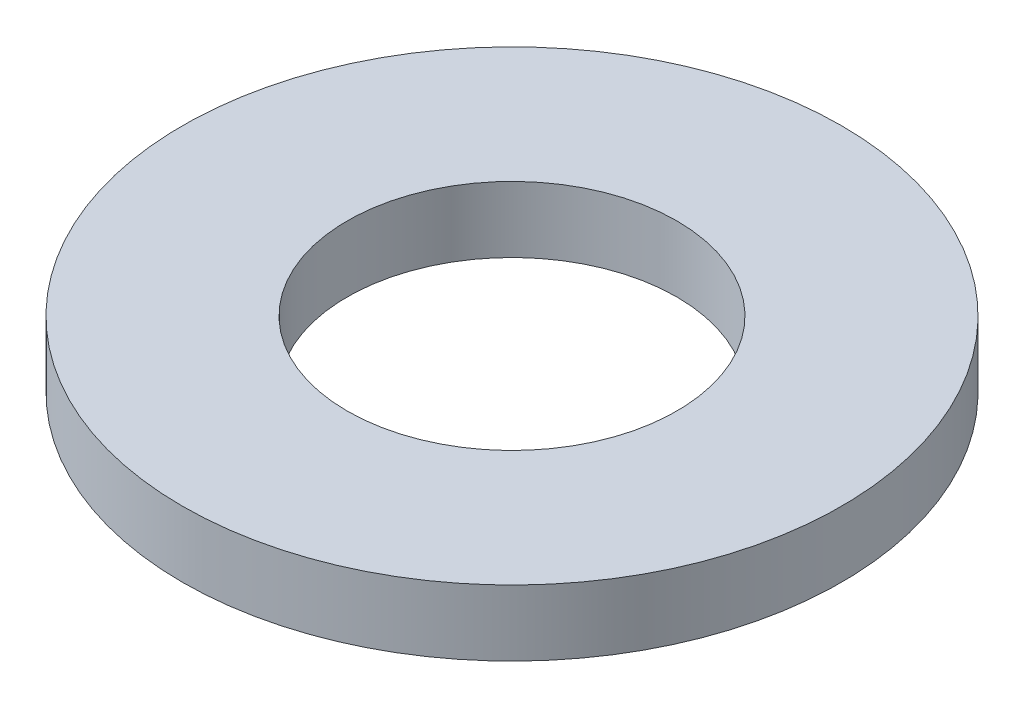
ISO-10303-21;
HEADER;
FILE_DESCRIPTION(('STEP AP214'),'2;1');
FILE_NAME('part.step','',(''),(''),'','','');
FILE_SCHEMA(('AUTOMOTIVE_DESIGN { 1 0 10303 214 1 1 1 1 }'));
ENDSEC;
DATA;
#1=APPLICATION_CONTEXT('core data for automotive mechanical design processes');
#2=APPLICATION_PROTOCOL_DEFINITION('international standard','automotive_design',2000,#1);
#3=PRODUCT_CONTEXT('',#1,'mechanical');
#4=PRODUCT('Part','Part','',(#3));
#5=PRODUCT_RELATED_PRODUCT_CATEGORY('part','',(#4));
#6=PRODUCT_DEFINITION_FORMATION('','',#4);
#7=PRODUCT_DEFINITION_CONTEXT('part definition',#1,'design');
#8=PRODUCT_DEFINITION('design','',#6,#7);
#9=PRODUCT_DEFINITION_SHAPE('','',#8);
#10=(LENGTH_UNIT() NAMED_UNIT(*) SI_UNIT(.MILLI.,.METRE.));
#11=(NAMED_UNIT(*) PLANE_ANGLE_UNIT() SI_UNIT($,.RADIAN.));
#12=(NAMED_UNIT(*) SI_UNIT($,.STERADIAN.) SOLID_ANGLE_UNIT());
#13=UNCERTAINTY_MEASURE_WITH_UNIT(LENGTH_MEASURE(1.E-05),#10,'distance_accuracy_value','');
#14=(GEOMETRIC_REPRESENTATION_CONTEXT(3) GLOBAL_UNCERTAINTY_ASSIGNED_CONTEXT((#13)) GLOBAL_UNIT_ASSIGNED_CONTEXT((#10,
#11,#12)) REPRESENTATION_CONTEXT('',''));
#15=CARTESIAN_POINT('',(0.,0.,0.));
#16=DIRECTION('',(0.,0.,1.));
#17=DIRECTION('',(1.,0.,0.));
#18=AXIS2_PLACEMENT_3D('',#15,#16,#17);
#19=CARTESIAN_POINT('',(0.,0.5,0.));
#20=DIRECTION('',(0.,1.,0.));
#21=DIRECTION('',(0.,0.,1.));
#22=AXIS2_PLACEMENT_3D('',#19,#20,#21);
#23=PLANE('',#22);
#24=CARTESIAN_POINT('',(0.,0.5,0.));
#25=DIRECTION('',(0.,1.,0.));
#26=DIRECTION('',(0.,0.,1.));
#27=AXIS2_PLACEMENT_3D('',#24,#25,#26);
#28=CIRCLE('',#27,2.5);
#29=CARTESIAN_POINT('',(0.,0.5,2.5));
#30=VERTEX_POINT('',#29);
#31=EDGE_CURVE('E10',#30,#30,#28,.T.);
#32=ORIENTED_EDGE('',*,*,#31,.T.);
#33=EDGE_LOOP('',(#32));
#34=FACE_BOUND('',#33,.T.);
#35=CARTESIAN_POINT('',(0.,0.5,0.));
#36=DIRECTION('',(0.,1.,0.));
#37=DIRECTION('',(0.,0.,1.));
#38=AXIS2_PLACEMENT_3D('',#35,#36,#37);
#39=CIRCLE('',#38,1.25);
#40=CARTESIAN_POINT('',(0.,0.5,1.25));
#41=VERTEX_POINT('',#40);
#42=EDGE_CURVE('E48',#41,#41,#39,.T.);
#43=ORIENTED_EDGE('',*,*,#42,.F.);
#44=EDGE_LOOP('',(#43));
#45=FACE_BOUND('',#44,.T.);
#46=ADVANCED_FACE('F37',(#34,#45),#23,.T.);
#47=CARTESIAN_POINT('',(0.,0.,0.));
#48=DIRECTION('',(0.,1.,0.));
#49=DIRECTION('',(0.,0.,1.));
#50=AXIS2_PLACEMENT_3D('',#47,#48,#49);
#51=PLANE('',#50);
#52=CARTESIAN_POINT('',(0.,0.,0.));
#53=DIRECTION('',(0.,1.,0.));
#54=DIRECTION('',(0.,0.,1.));
#55=AXIS2_PLACEMENT_3D('',#52,#53,#54);
#56=CIRCLE('',#55,2.5);
#57=CARTESIAN_POINT('',(0.,0.,2.5));
#58=VERTEX_POINT('',#57);
#59=EDGE_CURVE('E41',#58,#58,#56,.T.);
#60=ORIENTED_EDGE('',*,*,#59,.F.);
#61=EDGE_LOOP('',(#60));
#62=FACE_BOUND('',#61,.T.);
#63=CARTESIAN_POINT('',(0.,0.,0.));
#64=DIRECTION('',(0.,1.,0.));
#65=DIRECTION('',(0.,0.,1.));
#66=AXIS2_PLACEMENT_3D('',#63,#64,#65);
#67=CIRCLE('',#66,1.25);
#68=CARTESIAN_POINT('',(0.,0.,1.25));
#69=VERTEX_POINT('',#68);
#70=EDGE_CURVE('E50',#69,#69,#67,.T.);
#71=ORIENTED_EDGE('',*,*,#70,.T.);
#72=EDGE_LOOP('',(#71));
#73=FACE_BOUND('',#72,.T.);
#74=ADVANCED_FACE('F60',(#62,#73),#51,.F.);
#75=CARTESIAN_POINT('',(0.,0.5,0.));
#76=DIRECTION('',(0.,-1.,0.));
#77=DIRECTION('',(0.,0.,-1.));
#78=AXIS2_PLACEMENT_3D('',#75,#76,#77);
#79=CYLINDRICAL_SURFACE('',#78,2.5);
#80=ORIENTED_EDGE('',*,*,#31,.F.);
#81=EDGE_LOOP('',(#80));
#82=FACE_BOUND('',#81,.T.);
#83=ORIENTED_EDGE('',*,*,#59,.T.);
#84=EDGE_LOOP('',(#83));
#85=FACE_BOUND('',#84,.T.);
#86=ADVANCED_FACE('F39',(#82,#85),#79,.T.);
#87=CARTESIAN_POINT('',(0.,0.5,0.));
#88=DIRECTION('',(0.,-1.,0.));
#89=DIRECTION('',(0.,0.,-1.));
#90=AXIS2_PLACEMENT_3D('',#87,#88,#89);
#91=CYLINDRICAL_SURFACE('',#90,1.25);
#92=ORIENTED_EDGE('',*,*,#42,.T.);
#93=EDGE_LOOP('',(#92));
#94=FACE_BOUND('',#93,.T.);
#95=ORIENTED_EDGE('',*,*,#70,.F.);
#96=EDGE_LOOP('',(#95));
#97=FACE_BOUND('',#96,.T.);
#98=ADVANCED_FACE('F56',(#94,#97),#91,.F.);
#99=CLOSED_SHELL('',(#46,#74,#86,#98));
#100=MANIFOLD_SOLID_BREP('B2',#99);
#101=ADVANCED_BREP_SHAPE_REPRESENTATION('',(#18,#100),#14);
#102=SHAPE_DEFINITION_REPRESENTATION(#9,#101);
ENDSEC;
END-ISO-10303-21;
